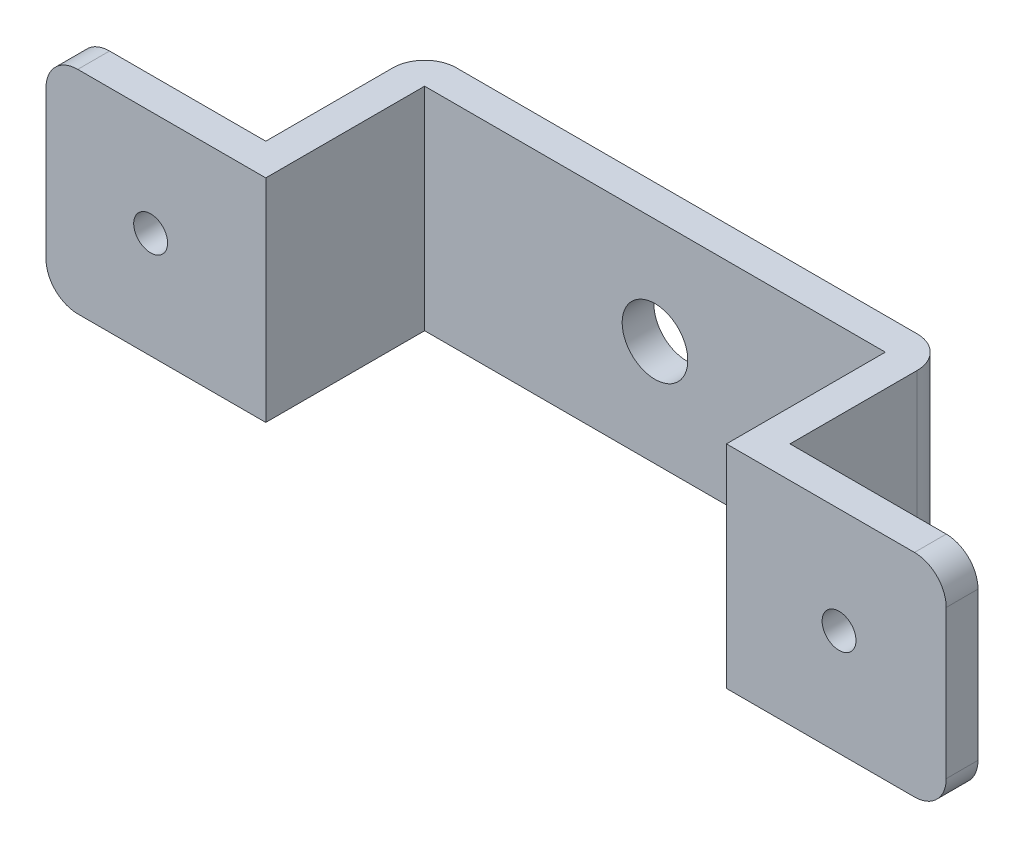
ISO-10303-21;
HEADER;
FILE_DESCRIPTION(('STEP AP214'),'2;1');
FILE_NAME('part.step','',(''),(''),'','','');
FILE_SCHEMA(('AUTOMOTIVE_DESIGN { 1 0 10303 214 1 1 1 1 }'));
ENDSEC;
DATA;
#1=APPLICATION_CONTEXT('core data for automotive mechanical design processes');
#2=APPLICATION_PROTOCOL_DEFINITION('international standard','automotive_design',2000,#1);
#3=PRODUCT_CONTEXT('',#1,'mechanical');
#4=PRODUCT('Part','Part','',(#3));
#5=PRODUCT_RELATED_PRODUCT_CATEGORY('part','',(#4));
#6=PRODUCT_DEFINITION_FORMATION('','',#4);
#7=PRODUCT_DEFINITION_CONTEXT('part definition',#1,'design');
#8=PRODUCT_DEFINITION('design','',#6,#7);
#9=PRODUCT_DEFINITION_SHAPE('','',#8);
#10=(LENGTH_UNIT() NAMED_UNIT(*) SI_UNIT(.MILLI.,.METRE.));
#11=(NAMED_UNIT(*) PLANE_ANGLE_UNIT() SI_UNIT($,.RADIAN.));
#12=(NAMED_UNIT(*) SI_UNIT($,.STERADIAN.) SOLID_ANGLE_UNIT());
#13=UNCERTAINTY_MEASURE_WITH_UNIT(LENGTH_MEASURE(1.E-05),#10,'distance_accuracy_value','');
#14=(GEOMETRIC_REPRESENTATION_CONTEXT(3) GLOBAL_UNCERTAINTY_ASSIGNED_CONTEXT((#13)) GLOBAL_UNIT_ASSIGNED_CONTEXT((#10,
#11,#12)) REPRESENTATION_CONTEXT('',''));
#15=CARTESIAN_POINT('',(0.,0.,0.));
#16=DIRECTION('',(0.,0.,1.));
#17=DIRECTION('',(1.,0.,0.));
#18=AXIS2_PLACEMENT_3D('',#15,#16,#17);
#19=CARTESIAN_POINT('',(0.,0.,3.));
#20=DIRECTION('',(0.,0.,-1.));
#21=DIRECTION('',(-1.,0.,0.));
#22=AXIS2_PLACEMENT_3D('',#19,#20,#21);
#23=PLANE('',#22);
#24=CARTESIAN_POINT('',(-32.6193518413738,0.0309925433625291,3.));
#25=DIRECTION('',(0.,0.,1.));
#26=DIRECTION('',(1.,0.,0.));
#27=AXIS2_PLACEMENT_3D('',#24,#25,#26);
#28=CIRCLE('',#27,1.6);
#29=CARTESIAN_POINT('',(-31.0193518413738,0.0309925433625291,3.));
#30=VERTEX_POINT('',#29);
#31=EDGE_CURVE('E364',#30,#30,#28,.T.);
#32=ORIENTED_EDGE('',*,*,#31,.F.);
#33=EDGE_LOOP('',(#32));
#34=FACE_BOUND('',#33,.T.);
#35=DIRECTION('',(0.,-1.,0.));
#36=VECTOR('',#35,1.);
#37=CARTESIAN_POINT('',(-42.5,-10.,3.));
#38=LINE('',#37,#36);
#39=CARTESIAN_POINT('',(-42.5,7.,3.));
#40=VERTEX_POINT('',#39);
#41=CARTESIAN_POINT('',(-42.5,-7.,3.));
#42=VERTEX_POINT('',#41);
#43=EDGE_CURVE('E184',#40,#42,#38,.T.);
#44=ORIENTED_EDGE('',*,*,#43,.T.);
#45=CARTESIAN_POINT('',(-39.5,-7.,3.));
#46=DIRECTION('',(0.,0.,-1.));
#47=DIRECTION('',(-1.,0.,0.));
#48=AXIS2_PLACEMENT_3D('',#45,#46,#47);
#49=CIRCLE('',#48,3.);
#50=CARTESIAN_POINT('',(-39.5,-10.,3.));
#51=VERTEX_POINT('',#50);
#52=EDGE_CURVE('E11',#42,#51,#49,.F.);
#53=ORIENTED_EDGE('',*,*,#52,.T.);
#54=DIRECTION('',(1.,0.,0.));
#55=VECTOR('',#54,1.);
#56=CARTESIAN_POINT('',(-42.5,-10.,3.));
#57=LINE('',#56,#55);
#58=CARTESIAN_POINT('',(-21.75,-10.,3.));
#59=VERTEX_POINT('',#58);
#60=EDGE_CURVE('E250',#51,#59,#57,.T.);
#61=ORIENTED_EDGE('',*,*,#60,.T.);
#62=DIRECTION('',(0.,-1.,0.));
#63=VECTOR('',#62,1.);
#64=CARTESIAN_POINT('',(-21.75,10.,3.));
#65=LINE('',#64,#63);
#66=CARTESIAN_POINT('',(-21.75,10.,3.));
#67=VERTEX_POINT('',#66);
#68=EDGE_CURVE('E201',#67,#59,#65,.T.);
#69=ORIENTED_EDGE('',*,*,#68,.F.);
#70=DIRECTION('',(-1.,0.,0.));
#71=VECTOR('',#70,1.);
#72=CARTESIAN_POINT('',(-42.5,10.,3.));
#73=LINE('',#72,#71);
#74=CARTESIAN_POINT('',(-39.5,10.,3.));
#75=VERTEX_POINT('',#74);
#76=EDGE_CURVE('E185',#67,#75,#73,.T.);
#77=ORIENTED_EDGE('',*,*,#76,.T.);
#78=CARTESIAN_POINT('',(-39.5,7.,3.));
#79=DIRECTION('',(0.,0.,-1.));
#80=DIRECTION('',(-1.,0.,0.));
#81=AXIS2_PLACEMENT_3D('',#78,#79,#80);
#82=CIRCLE('',#81,3.);
#83=EDGE_CURVE('E54',#75,#40,#82,.F.);
#84=ORIENTED_EDGE('',*,*,#83,.T.);
#85=EDGE_LOOP('',(#44,#53,#61,#69,#77,#84));
#86=FACE_BOUND('',#85,.T.);
#87=ADVANCED_FACE('F46',(#34,#86),#23,.F.);
#88=CARTESIAN_POINT('',(0.,0.,0.));
#89=DIRECTION('',(0.,0.,-1.));
#90=DIRECTION('',(-1.,0.,0.));
#91=AXIS2_PLACEMENT_3D('',#88,#89,#90);
#92=PLANE('',#91);
#93=CARTESIAN_POINT('',(-32.6193518413738,0.0309925433625291,0.));
#94=DIRECTION('',(0.,0.,-1.));
#95=DIRECTION('',(-1.,0.,0.));
#96=AXIS2_PLACEMENT_3D('',#93,#94,#95);
#97=CIRCLE('',#96,1.6);
#98=CARTESIAN_POINT('',(-34.2193518413738,0.0309925433625291,0.));
#99=VERTEX_POINT('',#98);
#100=EDGE_CURVE('E263',#99,#99,#97,.T.);
#101=ORIENTED_EDGE('',*,*,#100,.F.);
#102=EDGE_LOOP('',(#101));
#103=FACE_BOUND('',#102,.T.);
#104=DIRECTION('',(1.,0.,0.));
#105=VECTOR('',#104,1.);
#106=CARTESIAN_POINT('',(-42.5,-10.,0.));
#107=LINE('',#106,#105);
#108=CARTESIAN_POINT('',(-39.5,-10.,0.));
#109=VERTEX_POINT('',#108);
#110=CARTESIAN_POINT('',(-24.75,-10.,0.));
#111=VERTEX_POINT('',#110);
#112=EDGE_CURVE('E246',#109,#111,#107,.T.);
#113=ORIENTED_EDGE('',*,*,#112,.F.);
#114=CARTESIAN_POINT('',(-39.5,-7.,0.));
#115=DIRECTION('',(0.,0.,-1.));
#116=DIRECTION('',(-1.,0.,0.));
#117=AXIS2_PLACEMENT_3D('',#114,#115,#116);
#118=CIRCLE('',#117,3.);
#119=CARTESIAN_POINT('',(-42.5,-7.,0.));
#120=VERTEX_POINT('',#119);
#121=EDGE_CURVE('E307',#109,#120,#118,.T.);
#122=ORIENTED_EDGE('',*,*,#121,.T.);
#123=DIRECTION('',(0.,-1.,0.));
#124=VECTOR('',#123,1.);
#125=CARTESIAN_POINT('',(-42.5,-10.,0.));
#126=LINE('',#125,#124);
#127=CARTESIAN_POINT('',(-42.5,7.,0.));
#128=VERTEX_POINT('',#127);
#129=EDGE_CURVE('E259',#128,#120,#126,.T.);
#130=ORIENTED_EDGE('',*,*,#129,.F.);
#131=CARTESIAN_POINT('',(-39.5,7.,0.));
#132=DIRECTION('',(0.,0.,-1.));
#133=DIRECTION('',(-1.,0.,0.));
#134=AXIS2_PLACEMENT_3D('',#131,#132,#133);
#135=CIRCLE('',#134,3.);
#136=CARTESIAN_POINT('',(-39.5,10.,0.));
#137=VERTEX_POINT('',#136);
#138=EDGE_CURVE('E305',#128,#137,#135,.T.);
#139=ORIENTED_EDGE('',*,*,#138,.T.);
#140=DIRECTION('',(-1.,0.,0.));
#141=VECTOR('',#140,1.);
#142=CARTESIAN_POINT('',(-42.5,10.,0.));
#143=LINE('',#142,#141);
#144=CARTESIAN_POINT('',(-24.75,10.,0.));
#145=VERTEX_POINT('',#144);
#146=EDGE_CURVE('E255',#145,#137,#143,.T.);
#147=ORIENTED_EDGE('',*,*,#146,.F.);
#148=DIRECTION('',(0.,-1.,0.));
#149=VECTOR('',#148,1.);
#150=CARTESIAN_POINT('',(-24.75,0.,0.));
#151=LINE('',#150,#149);
#152=EDGE_CURVE('E217',#145,#111,#151,.T.);
#153=ORIENTED_EDGE('',*,*,#152,.T.);
#154=EDGE_LOOP('',(#113,#122,#130,#139,#147,#153));
#155=FACE_BOUND('',#154,.T.);
#156=ADVANCED_FACE('F318',(#103,#155),#92,.T.);
#157=CARTESIAN_POINT('',(32.3806481586264,0.0309925433625777,0.));
#158=DIRECTION('',(0.,0.,-1.));
#159=DIRECTION('',(-1.,0.,0.));
#160=AXIS2_PLACEMENT_3D('',#157,#158,#159);
#161=CIRCLE('',#160,1.59999999999999);
#162=CARTESIAN_POINT('',(30.7806481586264,0.0309925433625777,0.));
#163=VERTEX_POINT('',#162);
#164=EDGE_CURVE('E266',#163,#163,#161,.T.);
#165=ORIENTED_EDGE('',*,*,#164,.F.);
#166=EDGE_LOOP('',(#165));
#167=FACE_BOUND('',#166,.T.);
#168=DIRECTION('',(0.,1.,0.));
#169=VECTOR('',#168,1.);
#170=CARTESIAN_POINT('',(42.5,-10.,0.));
#171=LINE('',#170,#169);
#172=CARTESIAN_POINT('',(42.5,-7.,0.));
#173=VERTEX_POINT('',#172);
#174=CARTESIAN_POINT('',(42.5,7.,0.));
#175=VERTEX_POINT('',#174);
#176=EDGE_CURVE('E231',#173,#175,#171,.T.);
#177=ORIENTED_EDGE('',*,*,#176,.F.);
#178=CARTESIAN_POINT('',(39.5,-7.,0.));
#179=DIRECTION('',(0.,0.,-1.));
#180=DIRECTION('',(-1.,0.,0.));
#181=AXIS2_PLACEMENT_3D('',#178,#179,#180);
#182=CIRCLE('',#181,3.);
#183=CARTESIAN_POINT('',(39.5,-10.,0.));
#184=VERTEX_POINT('',#183);
#185=EDGE_CURVE('E300',#173,#184,#182,.T.);
#186=ORIENTED_EDGE('',*,*,#185,.T.);
#187=CARTESIAN_POINT('',(24.75,-10.,0.));
#188=VERTEX_POINT('',#187);
#189=EDGE_CURVE('E261',#188,#184,#107,.T.);
#190=ORIENTED_EDGE('',*,*,#189,.F.);
#191=DIRECTION('',(0.,-1.,0.));
#192=VECTOR('',#191,1.);
#193=CARTESIAN_POINT('',(24.75,0.,0.));
#194=LINE('',#193,#192);
#195=CARTESIAN_POINT('',(24.75,10.,0.));
#196=VERTEX_POINT('',#195);
#197=EDGE_CURVE('E222',#196,#188,#194,.T.);
#198=ORIENTED_EDGE('',*,*,#197,.F.);
#199=CARTESIAN_POINT('',(39.5,10.,0.));
#200=VERTEX_POINT('',#199);
#201=EDGE_CURVE('E256',#200,#196,#143,.T.);
#202=ORIENTED_EDGE('',*,*,#201,.F.);
#203=CARTESIAN_POINT('',(39.5,7.,0.));
#204=DIRECTION('',(0.,0.,-1.));
#205=DIRECTION('',(-1.,0.,0.));
#206=AXIS2_PLACEMENT_3D('',#203,#204,#205);
#207=CIRCLE('',#206,3.);
#208=EDGE_CURVE('E298',#200,#175,#207,.T.);
#209=ORIENTED_EDGE('',*,*,#208,.T.);
#210=EDGE_LOOP('',(#177,#186,#190,#198,#202,#209));
#211=FACE_BOUND('',#210,.T.);
#212=ADVANCED_FACE('F345',(#167,#211),#92,.T.);
#213=CARTESIAN_POINT('',(42.5,-10.,3.));
#214=DIRECTION('',(-1.,0.,0.));
#215=DIRECTION('',(0.,0.,1.));
#216=AXIS2_PLACEMENT_3D('',#213,#214,#215);
#217=PLANE('',#216);
#218=DIRECTION('',(0.,1.,0.));
#219=VECTOR('',#218,1.);
#220=CARTESIAN_POINT('',(42.5,-10.,3.));
#221=LINE('',#220,#219);
#222=CARTESIAN_POINT('',(42.5,-7.,3.));
#223=VERTEX_POINT('',#222);
#224=CARTESIAN_POINT('',(42.5,7.,3.));
#225=VERTEX_POINT('',#224);
#226=EDGE_CURVE('E245',#223,#225,#221,.T.);
#227=ORIENTED_EDGE('',*,*,#226,.F.);
#228=DIRECTION('',(0.,0.,-1.));
#229=VECTOR('',#228,1.);
#230=CARTESIAN_POINT('',(42.5,-7.,3.));
#231=LINE('',#230,#229);
#232=EDGE_CURVE('E295',#223,#173,#231,.T.);
#233=ORIENTED_EDGE('',*,*,#232,.T.);
#234=ORIENTED_EDGE('',*,*,#176,.T.);
#235=DIRECTION('',(0.,0.,-1.));
#236=VECTOR('',#235,1.);
#237=CARTESIAN_POINT('',(42.5,7.,3.));
#238=LINE('',#237,#236);
#239=EDGE_CURVE('E293',#175,#225,#238,.F.);
#240=ORIENTED_EDGE('',*,*,#239,.T.);
#241=EDGE_LOOP('',(#227,#233,#234,#240));
#242=FACE_BOUND('',#241,.T.);
#243=ADVANCED_FACE('F412',(#242),#217,.F.);
#244=CARTESIAN_POINT('',(-42.5,10.,3.));
#245=DIRECTION('',(0.,-1.,0.));
#246=DIRECTION('',(0.,0.,-1.));
#247=AXIS2_PLACEMENT_3D('',#244,#245,#246);
#248=PLANE('',#247);
#249=DIRECTION('',(1.,0.,0.));
#250=VECTOR('',#249,1.);
#251=CARTESIAN_POINT('',(24.75,10.,-15.));
#252=LINE('',#251,#250);
#253=CARTESIAN_POINT('',(-21.75,10.,-15.));
#254=VERTEX_POINT('',#253);
#255=CARTESIAN_POINT('',(21.75,10.,-15.));
#256=VERTEX_POINT('',#255);
#257=EDGE_CURVE('E214',#254,#256,#252,.T.);
#258=ORIENTED_EDGE('',*,*,#257,.F.);
#259=CARTESIAN_POINT('',(-21.75,10.,-12.));
#260=DIRECTION('',(0.,-1.,0.));
#261=DIRECTION('',(0.,0.,-1.));
#262=AXIS2_PLACEMENT_3D('',#259,#260,#261);
#263=CIRCLE('',#262,3.);
#264=CARTESIAN_POINT('',(-24.75,10.,-12.));
#265=VERTEX_POINT('',#264);
#266=EDGE_CURVE('E278',#254,#265,#263,.F.);
#267=ORIENTED_EDGE('',*,*,#266,.T.);
#268=DIRECTION('',(0.,0.,1.));
#269=VECTOR('',#268,1.);
#270=CARTESIAN_POINT('',(-24.75,10.,-12.));
#271=LINE('',#270,#269);
#272=EDGE_CURVE('E224',#265,#145,#271,.T.);
#273=ORIENTED_EDGE('',*,*,#272,.T.);
#274=ORIENTED_EDGE('',*,*,#146,.T.);
#275=DIRECTION('',(0.,0.,-1.));
#276=VECTOR('',#275,1.);
#277=CARTESIAN_POINT('',(-39.5,10.,3.));
#278=LINE('',#277,#276);
#279=EDGE_CURVE('E272',#137,#75,#278,.F.);
#280=ORIENTED_EDGE('',*,*,#279,.T.);
#281=ORIENTED_EDGE('',*,*,#76,.F.);
#282=DIRECTION('',(0.,0.,1.));
#283=VECTOR('',#282,1.);
#284=CARTESIAN_POINT('',(-21.75,10.,-12.));
#285=LINE('',#284,#283);
#286=CARTESIAN_POINT('',(-21.75,10.,-12.));
#287=VERTEX_POINT('',#286);
#288=EDGE_CURVE('E242',#287,#67,#285,.T.);
#289=ORIENTED_EDGE('',*,*,#288,.F.);
#290=DIRECTION('',(1.,0.,0.));
#291=VECTOR('',#290,1.);
#292=CARTESIAN_POINT('',(24.75,10.,-12.));
#293=LINE('',#292,#291);
#294=CARTESIAN_POINT('',(21.75,10.,-12.));
#295=VERTEX_POINT('',#294);
#296=EDGE_CURVE('E193',#287,#295,#293,.T.);
#297=ORIENTED_EDGE('',*,*,#296,.T.);
#298=DIRECTION('',(0.,0.,1.));
#299=VECTOR('',#298,1.);
#300=CARTESIAN_POINT('',(21.75,10.,-12.));
#301=LINE('',#300,#299);
#302=CARTESIAN_POINT('',(21.75,10.,3.));
#303=VERTEX_POINT('',#302);
#304=EDGE_CURVE('E188',#295,#303,#301,.T.);
#305=ORIENTED_EDGE('',*,*,#304,.T.);
#306=CARTESIAN_POINT('',(39.5,10.,3.));
#307=VERTEX_POINT('',#306);
#308=EDGE_CURVE('E171',#307,#303,#73,.T.);
#309=ORIENTED_EDGE('',*,*,#308,.F.);
#310=DIRECTION('',(0.,0.,-1.));
#311=VECTOR('',#310,1.);
#312=CARTESIAN_POINT('',(39.5,10.,3.));
#313=LINE('',#312,#311);
#314=EDGE_CURVE('E274',#307,#200,#313,.T.);
#315=ORIENTED_EDGE('',*,*,#314,.T.);
#316=ORIENTED_EDGE('',*,*,#201,.T.);
#317=DIRECTION('',(0.,0.,1.));
#318=VECTOR('',#317,1.);
#319=CARTESIAN_POINT('',(24.75,10.,-12.));
#320=LINE('',#319,#318);
#321=CARTESIAN_POINT('',(24.75,10.,-12.));
#322=VERTEX_POINT('',#321);
#323=EDGE_CURVE('E229',#322,#196,#320,.T.);
#324=ORIENTED_EDGE('',*,*,#323,.F.);
#325=CARTESIAN_POINT('',(21.75,10.,-12.));
#326=DIRECTION('',(0.,-1.,0.));
#327=DIRECTION('',(0.,0.,-1.));
#328=AXIS2_PLACEMENT_3D('',#325,#326,#327);
#329=CIRCLE('',#328,3.);
#330=EDGE_CURVE('E276',#322,#256,#329,.F.);
#331=ORIENTED_EDGE('',*,*,#330,.T.);
#332=EDGE_LOOP('',(#258,#267,#273,#274,#280,#281,#289,#297,#305,#309,#315,#316,#324,#331));
#333=FACE_BOUND('',#332,.T.);
#334=ADVANCED_FACE('F190',(#333),#248,.F.);
#335=CARTESIAN_POINT('',(-42.5,-10.,3.));
#336=DIRECTION('',(1.,0.,0.));
#337=DIRECTION('',(0.,0.,-1.));
#338=AXIS2_PLACEMENT_3D('',#335,#336,#337);
#339=PLANE('',#338);
#340=ORIENTED_EDGE('',*,*,#129,.T.);
#341=DIRECTION('',(0.,0.,-1.));
#342=VECTOR('',#341,1.);
#343=CARTESIAN_POINT('',(-42.5,-7.,3.));
#344=LINE('',#343,#342);
#345=EDGE_CURVE('E61',#120,#42,#344,.F.);
#346=ORIENTED_EDGE('',*,*,#345,.T.);
#347=ORIENTED_EDGE('',*,*,#43,.F.);
#348=DIRECTION('',(0.,0.,-1.));
#349=VECTOR('',#348,1.);
#350=CARTESIAN_POINT('',(-42.5,7.,3.));
#351=LINE('',#350,#349);
#352=EDGE_CURVE('E309',#40,#128,#351,.T.);
#353=ORIENTED_EDGE('',*,*,#352,.T.);
#354=EDGE_LOOP('',(#340,#346,#347,#353));
#355=FACE_BOUND('',#354,.T.);
#356=ADVANCED_FACE('F314',(#355),#339,.F.);
#357=CARTESIAN_POINT('',(-42.5,-10.,3.));
#358=DIRECTION('',(0.,1.,0.));
#359=DIRECTION('',(0.,0.,1.));
#360=AXIS2_PLACEMENT_3D('',#357,#358,#359);
#361=PLANE('',#360);
#362=DIRECTION('',(0.,0.,1.));
#363=VECTOR('',#362,1.);
#364=CARTESIAN_POINT('',(-24.75,-10.,-12.));
#365=LINE('',#364,#363);
#366=CARTESIAN_POINT('',(-24.75,-10.,-12.));
#367=VERTEX_POINT('',#366);
#368=EDGE_CURVE('E234',#367,#111,#365,.T.);
#369=ORIENTED_EDGE('',*,*,#368,.F.);
#370=CARTESIAN_POINT('',(-21.75,-10.,-12.));
#371=DIRECTION('',(0.,1.,0.));
#372=DIRECTION('',(0.,0.,1.));
#373=AXIS2_PLACEMENT_3D('',#370,#371,#372);
#374=CIRCLE('',#373,3.);
#375=CARTESIAN_POINT('',(-21.75,-10.,-15.));
#376=VERTEX_POINT('',#375);
#377=EDGE_CURVE('E289',#367,#376,#374,.F.);
#378=ORIENTED_EDGE('',*,*,#377,.T.);
#379=DIRECTION('',(-1.,0.,0.));
#380=VECTOR('',#379,1.);
#381=CARTESIAN_POINT('',(24.75,-10.,-15.));
#382=LINE('',#381,#380);
#383=CARTESIAN_POINT('',(21.75,-10.,-15.));
#384=VERTEX_POINT('',#383);
#385=EDGE_CURVE('E211',#384,#376,#382,.T.);
#386=ORIENTED_EDGE('',*,*,#385,.F.);
#387=CARTESIAN_POINT('',(21.75,-10.,-12.));
#388=DIRECTION('',(0.,1.,0.));
#389=DIRECTION('',(0.,0.,1.));
#390=AXIS2_PLACEMENT_3D('',#387,#388,#389);
#391=CIRCLE('',#390,3.);
#392=CARTESIAN_POINT('',(24.75,-10.,-12.));
#393=VERTEX_POINT('',#392);
#394=EDGE_CURVE('E287',#384,#393,#391,.F.);
#395=ORIENTED_EDGE('',*,*,#394,.T.);
#396=DIRECTION('',(0.,0.,1.));
#397=VECTOR('',#396,1.);
#398=CARTESIAN_POINT('',(24.75,-10.,-12.));
#399=LINE('',#398,#397);
#400=EDGE_CURVE('E227',#393,#188,#399,.T.);
#401=ORIENTED_EDGE('',*,*,#400,.T.);
#402=ORIENTED_EDGE('',*,*,#189,.T.);
#403=DIRECTION('',(0.,0.,-1.));
#404=VECTOR('',#403,1.);
#405=CARTESIAN_POINT('',(39.5,-10.,3.));
#406=LINE('',#405,#404);
#407=CARTESIAN_POINT('',(39.5,-10.,3.));
#408=VERTEX_POINT('',#407);
#409=EDGE_CURVE('E285',#184,#408,#406,.F.);
#410=ORIENTED_EDGE('',*,*,#409,.T.);
#411=CARTESIAN_POINT('',(21.75,-10.,3.));
#412=VERTEX_POINT('',#411);
#413=EDGE_CURVE('E249',#412,#408,#57,.T.);
#414=ORIENTED_EDGE('',*,*,#413,.F.);
#415=DIRECTION('',(0.,0.,1.));
#416=VECTOR('',#415,1.);
#417=CARTESIAN_POINT('',(21.75,-10.,-12.));
#418=LINE('',#417,#416);
#419=CARTESIAN_POINT('',(21.75,-10.,-12.));
#420=VERTEX_POINT('',#419);
#421=EDGE_CURVE('E197',#420,#412,#418,.T.);
#422=ORIENTED_EDGE('',*,*,#421,.F.);
#423=DIRECTION('',(-1.,0.,0.));
#424=VECTOR('',#423,1.);
#425=CARTESIAN_POINT('',(24.75,-10.,-12.));
#426=LINE('',#425,#424);
#427=CARTESIAN_POINT('',(-21.75,-10.,-12.));
#428=VERTEX_POINT('',#427);
#429=EDGE_CURVE('E205',#420,#428,#426,.T.);
#430=ORIENTED_EDGE('',*,*,#429,.T.);
#431=DIRECTION('',(0.,0.,1.));
#432=VECTOR('',#431,1.);
#433=CARTESIAN_POINT('',(-21.75,-10.,-12.));
#434=LINE('',#433,#432);
#435=EDGE_CURVE('E239',#428,#59,#434,.T.);
#436=ORIENTED_EDGE('',*,*,#435,.T.);
#437=ORIENTED_EDGE('',*,*,#60,.F.);
#438=DIRECTION('',(0.,0.,-1.));
#439=VECTOR('',#438,1.);
#440=CARTESIAN_POINT('',(-39.5,-10.,3.));
#441=LINE('',#440,#439);
#442=EDGE_CURVE('E282',#51,#109,#441,.T.);
#443=ORIENTED_EDGE('',*,*,#442,.T.);
#444=ORIENTED_EDGE('',*,*,#112,.T.);
#445=EDGE_LOOP('',(#369,#378,#386,#395,#401,#402,#410,#414,#422,#430,#436,#437,#443,#444));
#446=FACE_BOUND('',#445,.T.);
#447=ADVANCED_FACE('F328',(#446),#361,.F.);
#448=CARTESIAN_POINT('',(32.3806481586264,0.0309925433625777,3.));
#449=DIRECTION('',(0.,0.,1.));
#450=DIRECTION('',(1.,0.,0.));
#451=AXIS2_PLACEMENT_3D('',#448,#449,#450);
#452=CIRCLE('',#451,1.59999999999999);
#453=CARTESIAN_POINT('',(33.9806481586264,0.0309925433625777,3.));
#454=VERTEX_POINT('',#453);
#455=EDGE_CURVE('E362',#454,#454,#452,.T.);
#456=ORIENTED_EDGE('',*,*,#455,.F.);
#457=EDGE_LOOP('',(#456));
#458=FACE_BOUND('',#457,.T.);
#459=ORIENTED_EDGE('',*,*,#413,.T.);
#460=CARTESIAN_POINT('',(39.5,-7.,3.));
#461=DIRECTION('',(0.,0.,-1.));
#462=DIRECTION('',(-1.,0.,0.));
#463=AXIS2_PLACEMENT_3D('',#460,#461,#462);
#464=CIRCLE('',#463,3.);
#465=EDGE_CURVE('E303',#408,#223,#464,.F.);
#466=ORIENTED_EDGE('',*,*,#465,.T.);
#467=ORIENTED_EDGE('',*,*,#226,.T.);
#468=CARTESIAN_POINT('',(39.5,7.,3.));
#469=DIRECTION('',(0.,0.,-1.));
#470=DIRECTION('',(-1.,0.,0.));
#471=AXIS2_PLACEMENT_3D('',#468,#469,#470);
#472=CIRCLE('',#471,3.);
#473=EDGE_CURVE('E180',#225,#307,#472,.F.);
#474=ORIENTED_EDGE('',*,*,#473,.T.);
#475=ORIENTED_EDGE('',*,*,#308,.T.);
#476=DIRECTION('',(0.,-1.,0.));
#477=VECTOR('',#476,1.);
#478=CARTESIAN_POINT('',(21.75,10.,3.));
#479=LINE('',#478,#477);
#480=EDGE_CURVE('E176',#303,#412,#479,.T.);
#481=ORIENTED_EDGE('',*,*,#480,.T.);
#482=EDGE_LOOP('',(#459,#466,#467,#474,#475,#481));
#483=FACE_BOUND('',#482,.T.);
#484=ADVANCED_FACE('F174',(#458,#483),#23,.F.);
#485=CARTESIAN_POINT('',(-24.75,0.,-12.));
#486=DIRECTION('',(-1.,0.,0.));
#487=DIRECTION('',(0.,0.,1.));
#488=AXIS2_PLACEMENT_3D('',#485,#486,#487);
#489=PLANE('',#488);
#490=ORIENTED_EDGE('',*,*,#272,.F.);
#491=DIRECTION('',(0.,1.,0.));
#492=VECTOR('',#491,1.);
#493=CARTESIAN_POINT('',(-24.75,0.,-12.));
#494=LINE('',#493,#492);
#495=EDGE_CURVE('E280',#265,#367,#494,.F.);
#496=ORIENTED_EDGE('',*,*,#495,.T.);
#497=ORIENTED_EDGE('',*,*,#368,.T.);
#498=ORIENTED_EDGE('',*,*,#152,.F.);
#499=EDGE_LOOP('',(#490,#496,#497,#498));
#500=FACE_BOUND('',#499,.T.);
#501=ADVANCED_FACE('F351',(#500),#489,.T.);
#502=CARTESIAN_POINT('',(-21.75,0.,-12.));
#503=DIRECTION('',(1.,0.,0.));
#504=DIRECTION('',(0.,0.,-1.));
#505=AXIS2_PLACEMENT_3D('',#502,#503,#504);
#506=PLANE('',#505);
#507=ORIENTED_EDGE('',*,*,#288,.T.);
#508=ORIENTED_EDGE('',*,*,#68,.T.);
#509=ORIENTED_EDGE('',*,*,#435,.F.);
#510=DIRECTION('',(0.,1.,0.));
#511=VECTOR('',#510,1.);
#512=CARTESIAN_POINT('',(-21.75,0.,-12.));
#513=LINE('',#512,#511);
#514=EDGE_CURVE('E232',#428,#287,#513,.T.);
#515=ORIENTED_EDGE('',*,*,#514,.T.);
#516=EDGE_LOOP('',(#507,#508,#509,#515));
#517=FACE_BOUND('',#516,.T.);
#518=ADVANCED_FACE('F357',(#517),#506,.T.);
#519=CARTESIAN_POINT('',(24.75,0.,-12.));
#520=DIRECTION('',(-1.,0.,0.));
#521=DIRECTION('',(0.,0.,1.));
#522=AXIS2_PLACEMENT_3D('',#519,#520,#521);
#523=PLANE('',#522);
#524=ORIENTED_EDGE('',*,*,#400,.F.);
#525=DIRECTION('',(0.,-1.,0.));
#526=VECTOR('',#525,1.);
#527=CARTESIAN_POINT('',(24.75,10.,-12.));
#528=LINE('',#527,#526);
#529=EDGE_CURVE('E291',#393,#322,#528,.F.);
#530=ORIENTED_EDGE('',*,*,#529,.T.);
#531=ORIENTED_EDGE('',*,*,#323,.T.);
#532=ORIENTED_EDGE('',*,*,#197,.T.);
#533=EDGE_LOOP('',(#524,#530,#531,#532));
#534=FACE_BOUND('',#533,.T.);
#535=ADVANCED_FACE('F400',(#534),#523,.F.);
#536=CARTESIAN_POINT('',(21.75,0.,-12.));
#537=DIRECTION('',(1.,0.,0.));
#538=DIRECTION('',(0.,0.,-1.));
#539=AXIS2_PLACEMENT_3D('',#536,#537,#538);
#540=PLANE('',#539);
#541=ORIENTED_EDGE('',*,*,#421,.T.);
#542=ORIENTED_EDGE('',*,*,#480,.F.);
#543=ORIENTED_EDGE('',*,*,#304,.F.);
#544=DIRECTION('',(0.,1.,0.));
#545=VECTOR('',#544,1.);
#546=CARTESIAN_POINT('',(21.75,0.,-12.));
#547=LINE('',#546,#545);
#548=EDGE_CURVE('E198',#420,#295,#547,.T.);
#549=ORIENTED_EDGE('',*,*,#548,.F.);
#550=EDGE_LOOP('',(#541,#542,#543,#549));
#551=FACE_BOUND('',#550,.T.);
#552=ADVANCED_FACE('F200',(#551),#540,.F.);
#553=CARTESIAN_POINT('',(0.,0.,-12.));
#554=DIRECTION('',(0.,0.,-1.));
#555=DIRECTION('',(-1.,0.,0.));
#556=AXIS2_PLACEMENT_3D('',#553,#554,#555);
#557=PLANE('',#556);
#558=CARTESIAN_POINT('',(0.,0.,-12.));
#559=DIRECTION('',(0.,0.,-1.));
#560=DIRECTION('',(-1.,0.,0.));
#561=AXIS2_PLACEMENT_3D('',#558,#559,#560);
#562=CIRCLE('',#561,3.1);
#563=CARTESIAN_POINT('',(-3.1,0.,-12.));
#564=VERTEX_POINT('',#563);
#565=EDGE_CURVE('E202',#564,#564,#562,.T.);
#566=ORIENTED_EDGE('',*,*,#565,.T.);
#567=EDGE_LOOP('',(#566));
#568=FACE_BOUND('',#567,.T.);
#569=ORIENTED_EDGE('',*,*,#514,.F.);
#570=ORIENTED_EDGE('',*,*,#429,.F.);
#571=ORIENTED_EDGE('',*,*,#548,.T.);
#572=ORIENTED_EDGE('',*,*,#296,.F.);
#573=EDGE_LOOP('',(#569,#570,#571,#572));
#574=FACE_BOUND('',#573,.T.);
#575=ADVANCED_FACE('F380',(#568,#574),#557,.F.);
#576=CARTESIAN_POINT('',(0.,0.,-15.));
#577=DIRECTION('',(0.,0.,-1.));
#578=DIRECTION('',(-1.,0.,0.));
#579=AXIS2_PLACEMENT_3D('',#576,#577,#578);
#580=PLANE('',#579);
#581=CARTESIAN_POINT('',(0.,0.,-15.));
#582=DIRECTION('',(0.,0.,-1.));
#583=DIRECTION('',(-1.,0.,0.));
#584=AXIS2_PLACEMENT_3D('',#581,#582,#583);
#585=CIRCLE('',#584,3.1);
#586=CARTESIAN_POINT('',(-3.1,0.,-15.));
#587=VERTEX_POINT('',#586);
#588=EDGE_CURVE('E208',#587,#587,#585,.T.);
#589=ORIENTED_EDGE('',*,*,#588,.F.);
#590=EDGE_LOOP('',(#589));
#591=FACE_BOUND('',#590,.T.);
#592=ORIENTED_EDGE('',*,*,#385,.T.);
#593=DIRECTION('',(0.,1.,0.));
#594=VECTOR('',#593,1.);
#595=CARTESIAN_POINT('',(-21.75,0.,-15.));
#596=LINE('',#595,#594);
#597=EDGE_CURVE('E269',#376,#254,#596,.T.);
#598=ORIENTED_EDGE('',*,*,#597,.T.);
#599=ORIENTED_EDGE('',*,*,#257,.T.);
#600=DIRECTION('',(0.,-1.,0.));
#601=VECTOR('',#600,1.);
#602=CARTESIAN_POINT('',(21.75,-10.,-15.));
#603=LINE('',#602,#601);
#604=EDGE_CURVE('E252',#256,#384,#603,.T.);
#605=ORIENTED_EDGE('',*,*,#604,.T.);
#606=EDGE_LOOP('',(#592,#598,#599,#605));
#607=FACE_BOUND('',#606,.T.);
#608=ADVANCED_FACE('F377',(#591,#607),#580,.T.);
#609=CARTESIAN_POINT('',(0.,0.,3.));
#610=DIRECTION('',(0.,0.,-1.));
#611=DIRECTION('',(-1.,0.,0.));
#612=AXIS2_PLACEMENT_3D('',#609,#610,#611);
#613=CYLINDRICAL_SURFACE('',#612,3.1);
#614=ORIENTED_EDGE('',*,*,#588,.T.);
#615=EDGE_LOOP('',(#614));
#616=FACE_BOUND('',#615,.T.);
#617=ORIENTED_EDGE('',*,*,#565,.F.);
#618=EDGE_LOOP('',(#617));
#619=FACE_BOUND('',#618,.T.);
#620=ADVANCED_FACE('F374',(#616,#619),#613,.F.);
#621=CARTESIAN_POINT('',(32.3806481586264,0.0309925433625777,-15.));
#622=DIRECTION('',(0.,0.,1.));
#623=DIRECTION('',(1.,0.,0.));
#624=AXIS2_PLACEMENT_3D('',#621,#622,#623);
#625=CYLINDRICAL_SURFACE('',#624,1.59999999999999);
#626=ORIENTED_EDGE('',*,*,#164,.T.);
#627=EDGE_LOOP('',(#626));
#628=FACE_BOUND('',#627,.T.);
#629=ORIENTED_EDGE('',*,*,#455,.T.);
#630=EDGE_LOOP('',(#629));
#631=FACE_BOUND('',#630,.T.);
#632=ADVANCED_FACE('F516',(#628,#631),#625,.F.);
#633=CARTESIAN_POINT('',(-32.6193518413738,0.0309925433625291,-15.));
#634=DIRECTION('',(0.,0.,1.));
#635=DIRECTION('',(1.,0.,0.));
#636=AXIS2_PLACEMENT_3D('',#633,#634,#635);
#637=CYLINDRICAL_SURFACE('',#636,1.6);
#638=ORIENTED_EDGE('',*,*,#100,.T.);
#639=EDGE_LOOP('',(#638));
#640=FACE_BOUND('',#639,.T.);
#641=ORIENTED_EDGE('',*,*,#31,.T.);
#642=EDGE_LOOP('',(#641));
#643=FACE_BOUND('',#642,.T.);
#644=ADVANCED_FACE('F426',(#640,#643),#637,.F.);
#645=CARTESIAN_POINT('',(-21.75,0.,-12.));
#646=DIRECTION('',(0.,1.,0.));
#647=DIRECTION('',(0.,0.,1.));
#648=AXIS2_PLACEMENT_3D('',#645,#646,#647);
#649=CYLINDRICAL_SURFACE('',#648,3.);
#650=ORIENTED_EDGE('',*,*,#377,.F.);
#651=ORIENTED_EDGE('',*,*,#495,.F.);
#652=ORIENTED_EDGE('',*,*,#266,.F.);
#653=ORIENTED_EDGE('',*,*,#597,.F.);
#654=EDGE_LOOP('',(#650,#651,#652,#653));
#655=FACE_BOUND('',#654,.T.);
#656=ADVANCED_FACE('F387',(#655),#649,.T.);
#657=CARTESIAN_POINT('',(21.75,0.,-12.));
#658=DIRECTION('',(0.,1.,0.));
#659=DIRECTION('',(0.,0.,1.));
#660=AXIS2_PLACEMENT_3D('',#657,#658,#659);
#661=CYLINDRICAL_SURFACE('',#660,3.);
#662=ORIENTED_EDGE('',*,*,#330,.F.);
#663=ORIENTED_EDGE('',*,*,#529,.F.);
#664=ORIENTED_EDGE('',*,*,#394,.F.);
#665=ORIENTED_EDGE('',*,*,#604,.F.);
#666=EDGE_LOOP('',(#662,#663,#664,#665));
#667=FACE_BOUND('',#666,.T.);
#668=ADVANCED_FACE('F394',(#667),#661,.T.);
#669=CARTESIAN_POINT('',(39.5,-7.,3.));
#670=DIRECTION('',(0.,0.,-1.));
#671=DIRECTION('',(-1.,0.,0.));
#672=AXIS2_PLACEMENT_3D('',#669,#670,#671);
#673=CYLINDRICAL_SURFACE('',#672,3.);
#674=ORIENTED_EDGE('',*,*,#465,.F.);
#675=ORIENTED_EDGE('',*,*,#409,.F.);
#676=ORIENTED_EDGE('',*,*,#185,.F.);
#677=ORIENTED_EDGE('',*,*,#232,.F.);
#678=EDGE_LOOP('',(#674,#675,#676,#677));
#679=FACE_BOUND('',#678,.T.);
#680=ADVANCED_FACE('F408',(#679),#673,.T.);
#681=CARTESIAN_POINT('',(39.5,7.,3.));
#682=DIRECTION('',(0.,0.,-1.));
#683=DIRECTION('',(-1.,0.,0.));
#684=AXIS2_PLACEMENT_3D('',#681,#682,#683);
#685=CYLINDRICAL_SURFACE('',#684,3.);
#686=ORIENTED_EDGE('',*,*,#473,.F.);
#687=ORIENTED_EDGE('',*,*,#239,.F.);
#688=ORIENTED_EDGE('',*,*,#208,.F.);
#689=ORIENTED_EDGE('',*,*,#314,.F.);
#690=EDGE_LOOP('',(#686,#687,#688,#689));
#691=FACE_BOUND('',#690,.T.);
#692=ADVANCED_FACE('F337',(#691),#685,.T.);
#693=CARTESIAN_POINT('',(-39.5,-7.,3.));
#694=DIRECTION('',(0.,0.,-1.));
#695=DIRECTION('',(-1.,0.,0.));
#696=AXIS2_PLACEMENT_3D('',#693,#694,#695);
#697=CYLINDRICAL_SURFACE('',#696,3.);
#698=ORIENTED_EDGE('',*,*,#52,.F.);
#699=ORIENTED_EDGE('',*,*,#345,.F.);
#700=ORIENTED_EDGE('',*,*,#121,.F.);
#701=ORIENTED_EDGE('',*,*,#442,.F.);
#702=EDGE_LOOP('',(#698,#699,#700,#701));
#703=FACE_BOUND('',#702,.T.);
#704=ADVANCED_FACE('F324',(#703),#697,.T.);
#705=CARTESIAN_POINT('',(-39.5,7.,3.));
#706=DIRECTION('',(0.,0.,-1.));
#707=DIRECTION('',(-1.,0.,0.));
#708=AXIS2_PLACEMENT_3D('',#705,#706,#707);
#709=CYLINDRICAL_SURFACE('',#708,3.);
#710=ORIENTED_EDGE('',*,*,#83,.F.);
#711=ORIENTED_EDGE('',*,*,#279,.F.);
#712=ORIENTED_EDGE('',*,*,#138,.F.);
#713=ORIENTED_EDGE('',*,*,#352,.F.);
#714=EDGE_LOOP('',(#710,#711,#712,#713));
#715=FACE_BOUND('',#714,.T.);
#716=ADVANCED_FACE('F48',(#715),#709,.T.);
#717=CLOSED_SHELL('',(#87,#156,#212,#243,#334,#356,#447,#484,#501,#518,#535,#552,#575,#608,#620,
#632,#644,#656,#668,#680,#692,#704,#716));
#718=MANIFOLD_SOLID_BREP('B2',#717);
#719=ADVANCED_BREP_SHAPE_REPRESENTATION('',(#18,#718),#14);
#720=SHAPE_DEFINITION_REPRESENTATION(#9,#719);
ENDSEC;
END-ISO-10303-21;
